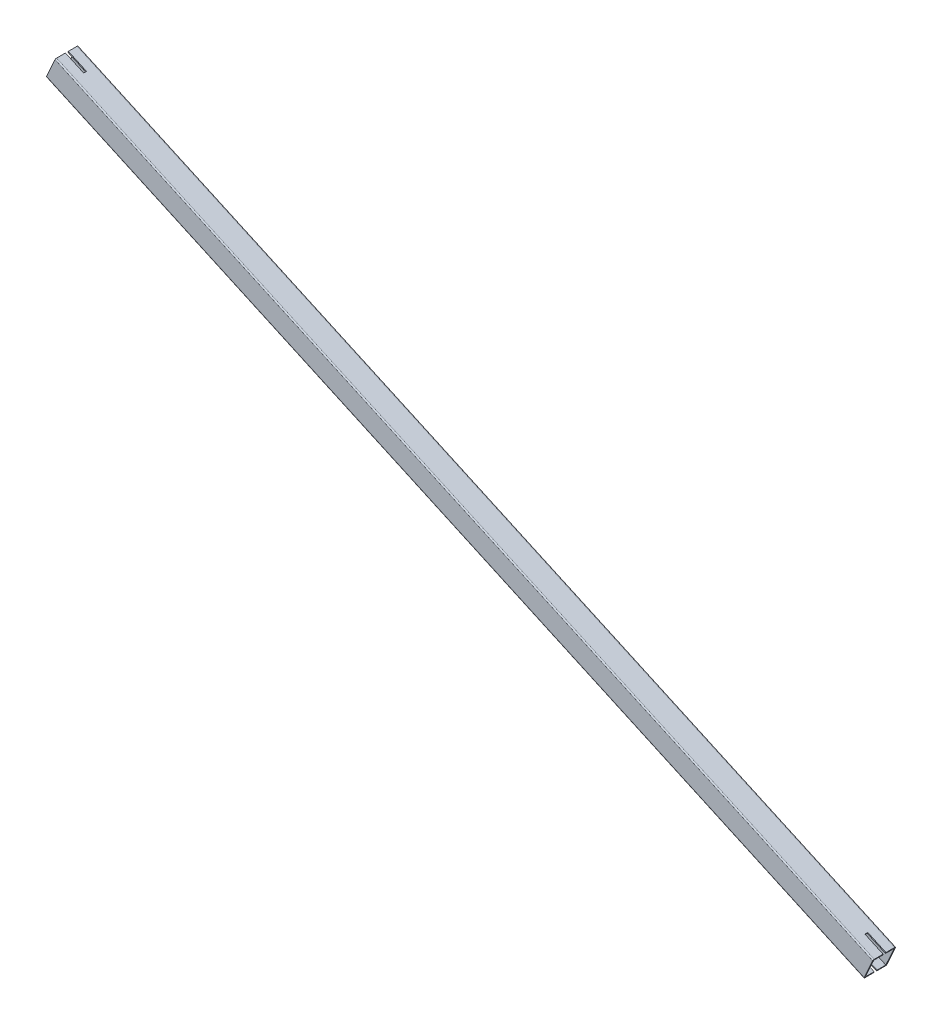
ISO-10303-21;
HEADER;
FILE_DESCRIPTION(('STEP AP214'),'2;1');
FILE_NAME('part.step','',(''),(''),'','','');
FILE_SCHEMA(('AUTOMOTIVE_DESIGN { 1 0 10303 214 1 1 1 1 }'));
ENDSEC;
DATA;
#1=APPLICATION_CONTEXT('core data for automotive mechanical design processes');
#2=APPLICATION_PROTOCOL_DEFINITION('international standard','automotive_design',2000,#1);
#3=PRODUCT_CONTEXT('',#1,'mechanical');
#4=PRODUCT('Part','Part','',(#3));
#5=PRODUCT_RELATED_PRODUCT_CATEGORY('part','',(#4));
#6=PRODUCT_DEFINITION_FORMATION('','',#4);
#7=PRODUCT_DEFINITION_CONTEXT('part definition',#1,'design');
#8=PRODUCT_DEFINITION('design','',#6,#7);
#9=PRODUCT_DEFINITION_SHAPE('','',#8);
#10=(LENGTH_UNIT() NAMED_UNIT(*) SI_UNIT(.MILLI.,.METRE.));
#11=(NAMED_UNIT(*) PLANE_ANGLE_UNIT() SI_UNIT($,.RADIAN.));
#12=(NAMED_UNIT(*) SI_UNIT($,.STERADIAN.) SOLID_ANGLE_UNIT());
#13=UNCERTAINTY_MEASURE_WITH_UNIT(LENGTH_MEASURE(1.E-05),#10,'distance_accuracy_value','');
#14=(GEOMETRIC_REPRESENTATION_CONTEXT(3) GLOBAL_UNCERTAINTY_ASSIGNED_CONTEXT((#13)) GLOBAL_UNIT_ASSIGNED_CONTEXT((#10,
#11,#12)) REPRESENTATION_CONTEXT('',''));
#15=CARTESIAN_POINT('',(0.,0.,0.));
#16=DIRECTION('',(0.,0.,1.));
#17=DIRECTION('',(1.,0.,0.));
#18=AXIS2_PLACEMENT_3D('',#15,#16,#17);
#19=CARTESIAN_POINT('',(2882.5508961991,-1270.70699172655,35.999));
#20=DIRECTION('',(0.910366477462605,-0.413802944301184,0.));
#21=DIRECTION('',(0.413802944301184,0.910366477462605,0.));
#22=AXIS2_PLACEMENT_3D('',#19,#20,#21);
#23=PLANE('',#22);
#24=DIRECTION('',(0.413802944301184,0.910366477462605,0.));
#25=VECTOR('',#24,1.);
#26=CARTESIAN_POINT('',(2882.5508961991,-1270.70699172655,-4.99999999999999));
#27=LINE('',#26,#25);
#28=CARTESIAN_POINT('',(2851.10228623516,-1339.89393364724,-4.99999999999999));
#29=VERTEX_POINT('',#28);
#30=CARTESIAN_POINT('',(2852.75749801236,-1336.25246773738,-4.99999999999999));
#31=VERTEX_POINT('',#30);
#32=EDGE_CURVE('E367',#29,#31,#27,.T.);
#33=ORIENTED_EDGE('',*,*,#32,.F.);
#34=DIRECTION('',(0.,0.,-1.));
#35=VECTOR('',#34,1.);
#36=CARTESIAN_POINT('',(2851.10228623516,-1339.89393364723,-35.999));
#37=LINE('',#36,#35);
#38=CARTESIAN_POINT('',(2851.10228623516,-1339.89393364723,-35.999));
#39=VERTEX_POINT('',#38);
#40=EDGE_CURVE('E410',#29,#39,#37,.T.);
#41=ORIENTED_EDGE('',*,*,#40,.T.);
#42=CARTESIAN_POINT('',(2852.75791181531,-1336.25155737091,-35.999));
#43=DIRECTION('',(0.910366477462605,-0.413802944301184,0.));
#44=DIRECTION('',(0.413802944301184,0.910366477462605,0.));
#45=AXIS2_PLACEMENT_3D('',#42,#43,#44);
#46=CIRCLE('',#45,4.00099999999998);
#47=CARTESIAN_POINT('',(2852.75791181531,-1336.25155737091,-40.));
#48=VERTEX_POINT('',#47);
#49=EDGE_CURVE('E414',#39,#48,#46,.T.);
#50=ORIENTED_EDGE('',*,*,#49,.T.);
#51=DIRECTION('',(0.413802944301188,0.910366477462603,0.));
#52=VECTOR('',#51,1.);
#53=CARTESIAN_POINT('',(2852.75791181531,-1336.25155737091,-40.));
#54=LINE('',#53,#52);
#55=CARTESIAN_POINT('',(2882.5508961991,-1270.70699172655,-40.));
#56=VERTEX_POINT('',#55);
#57=EDGE_CURVE('E416',#48,#56,#54,.T.);
#58=ORIENTED_EDGE('',*,*,#57,.T.);
#59=CARTESIAN_POINT('',(2882.5508961991,-1270.70699172655,-35.999));
#60=DIRECTION('',(0.910366477462605,-0.413802944301184,0.));
#61=DIRECTION('',(0.413802944301184,0.910366477462605,0.));
#62=AXIS2_PLACEMENT_3D('',#59,#60,#61);
#63=CIRCLE('',#62,4.00099999999998);
#64=CARTESIAN_POINT('',(2884.20652177925,-1267.06461545023,-35.999));
#65=VERTEX_POINT('',#64);
#66=EDGE_CURVE('E418',#56,#65,#63,.T.);
#67=ORIENTED_EDGE('',*,*,#66,.T.);
#68=DIRECTION('',(0.,0.,1.));
#69=VECTOR('',#68,1.);
#70=CARTESIAN_POINT('',(2884.20652177925,-1267.06461545023,35.999));
#71=LINE('',#70,#69);
#72=CARTESIAN_POINT('',(2884.20652177925,-1267.06461545023,-4.99999999999999));
#73=VERTEX_POINT('',#72);
#74=EDGE_CURVE('E344',#65,#73,#71,.T.);
#75=ORIENTED_EDGE('',*,*,#74,.T.);
#76=CARTESIAN_POINT('',(2882.55131000205,-1270.70608136008,-4.99999999999999));
#77=VERTEX_POINT('',#76);
#78=EDGE_CURVE('E366',#77,#73,#27,.T.);
#79=ORIENTED_EDGE('',*,*,#78,.F.);
#80=DIRECTION('',(0.,0.,1.));
#81=VECTOR('',#80,1.);
#82=CARTESIAN_POINT('',(2882.55131000205,-1270.70608136008,35.999));
#83=LINE('',#82,#81);
#84=CARTESIAN_POINT('',(2882.55131000205,-1270.70608136008,-35.999));
#85=VERTEX_POINT('',#84);
#86=EDGE_CURVE('E519',#85,#77,#83,.T.);
#87=ORIENTED_EDGE('',*,*,#86,.F.);
#88=CARTESIAN_POINT('',(2882.5508961991,-1270.70699172655,-35.999));
#89=DIRECTION('',(0.910366477462605,-0.413802944301184,0.));
#90=DIRECTION('',(0.413802944301184,0.910366477462605,0.));
#91=AXIS2_PLACEMENT_3D('',#88,#89,#90);
#92=CIRCLE('',#91,0.00100000000009845);
#93=CARTESIAN_POINT('',(2882.5508961991,-1270.70699172655,-36.0000000000001));
#94=VERTEX_POINT('',#93);
#95=EDGE_CURVE('E522',#94,#85,#92,.T.);
#96=ORIENTED_EDGE('',*,*,#95,.F.);
#97=DIRECTION('',(0.413802944301188,0.910366477462603,0.));
#98=VECTOR('',#97,1.);
#99=CARTESIAN_POINT('',(2852.75791181531,-1336.25155737091,-36.));
#100=LINE('',#99,#98);
#101=CARTESIAN_POINT('',(2852.75791181531,-1336.25155737091,-36.));
#102=VERTEX_POINT('',#101);
#103=EDGE_CURVE('E400',#102,#94,#100,.T.);
#104=ORIENTED_EDGE('',*,*,#103,.F.);
#105=CARTESIAN_POINT('',(2852.75791181531,-1336.25155737091,-35.999));
#106=DIRECTION('',(0.910366477462605,-0.413802944301184,0.));
#107=DIRECTION('',(0.413802944301184,0.910366477462605,0.));
#108=AXIS2_PLACEMENT_3D('',#105,#106,#107);
#109=CIRCLE('',#108,0.00100000000009845);
#110=CARTESIAN_POINT('',(2852.75749801236,-1336.25246773738,-35.999));
#111=VERTEX_POINT('',#110);
#112=EDGE_CURVE('E395',#111,#102,#109,.T.);
#113=ORIENTED_EDGE('',*,*,#112,.F.);
#114=DIRECTION('',(0.,0.,-1.));
#115=VECTOR('',#114,1.);
#116=CARTESIAN_POINT('',(2852.75749801236,-1336.25246773738,-35.999));
#117=LINE('',#116,#115);
#118=EDGE_CURVE('E386',#31,#111,#117,.T.);
#119=ORIENTED_EDGE('',*,*,#118,.F.);
#120=EDGE_LOOP('',(#33,#41,#50,#58,#67,#75,#79,#87,#96,#104,#113,#119));
#121=FACE_BOUND('',#120,.T.);
#122=ADVANCED_FACE('F60',(#121),#23,.T.);
#123=CARTESIAN_POINT('',(14.8964921918981,32.7722828221759,35.999));
#124=DIRECTION('',(0.910366477462605,-0.413802944301184,0.));
#125=DIRECTION('',(0.413802944301184,0.910366477462605,0.));
#126=AXIS2_PLACEMENT_3D('',#123,#124,#125);
#127=PLANE('',#126);
#128=DIRECTION('',(0.,0.,1.));
#129=VECTOR('',#128,1.);
#130=CARTESIAN_POINT('',(16.5521177720476,36.4146590985035,35.999));
#131=LINE('',#130,#129);
#132=CARTESIAN_POINT('',(16.5521177720472,36.4146590985039,5.));
#133=VERTEX_POINT('',#132);
#134=CARTESIAN_POINT('',(16.5521177720476,36.4146590985035,35.999));
#135=VERTEX_POINT('',#134);
#136=EDGE_CURVE('E312',#133,#135,#131,.T.);
#137=ORIENTED_EDGE('',*,*,#136,.F.);
#138=DIRECTION('',(-0.413802944301184,-0.910366477462605,0.));
#139=VECTOR('',#138,1.);
#140=CARTESIAN_POINT('',(14.8964921918981,32.7722828221759,5.));
#141=LINE('',#140,#139);
#142=CARTESIAN_POINT('',(14.8969059948423,32.773193188653,5.));
#143=VERTEX_POINT('',#142);
#144=EDGE_CURVE('E362',#133,#143,#141,.T.);
#145=ORIENTED_EDGE('',*,*,#144,.T.);
#146=DIRECTION('',(0.,0.,1.));
#147=VECTOR('',#146,1.);
#148=CARTESIAN_POINT('',(14.8969059948425,32.7731931886532,35.999));
#149=LINE('',#148,#147);
#150=CARTESIAN_POINT('',(14.8969059948429,32.7731931886523,35.999));
#151=VERTEX_POINT('',#150);
#152=EDGE_CURVE('E433',#143,#151,#149,.T.);
#153=ORIENTED_EDGE('',*,*,#152,.T.);
#154=CARTESIAN_POINT('',(14.8964921918981,32.7722828221759,35.999));
#155=DIRECTION('',(0.910366477462605,-0.413802944301184,0.));
#156=DIRECTION('',(0.413802944301184,0.910366477462605,0.));
#157=AXIS2_PLACEMENT_3D('',#154,#155,#156);
#158=CIRCLE('',#157,0.00100000000009151);
#159=CARTESIAN_POINT('',(14.8964921918981,32.7722828221759,36.));
#160=VERTEX_POINT('',#159);
#161=EDGE_CURVE('E430',#151,#160,#158,.T.);
#162=ORIENTED_EDGE('',*,*,#161,.T.);
#163=DIRECTION('',(-0.413802944301188,-0.910366477462603,0.));
#164=VECTOR('',#163,1.);
#165=CARTESIAN_POINT('',(14.8964921918981,32.7722828221759,36.));
#166=LINE('',#165,#164);
#167=CARTESIAN_POINT('',(-14.8964921918986,-32.7722828221768,36.));
#168=VERTEX_POINT('',#167);
#169=EDGE_CURVE('E426',#160,#168,#166,.T.);
#170=ORIENTED_EDGE('',*,*,#169,.T.);
#171=CARTESIAN_POINT('',(-14.8964921918986,-32.7722828221768,35.999));
#172=DIRECTION('',(0.910366477462605,-0.413802944301184,0.));
#173=DIRECTION('',(0.413802944301184,0.910366477462605,0.));
#174=AXIS2_PLACEMENT_3D('',#171,#172,#173);
#175=CIRCLE('',#174,0.00100000000009151);
#176=CARTESIAN_POINT('',(-14.8969059948425,-32.7731931886541,35.999));
#177=VERTEX_POINT('',#176);
#178=EDGE_CURVE('E423',#168,#177,#175,.T.);
#179=ORIENTED_EDGE('',*,*,#178,.T.);
#180=DIRECTION('',(0.,0.,-1.));
#181=VECTOR('',#180,1.);
#182=CARTESIAN_POINT('',(-14.8969059948425,-32.7731931886541,-35.999));
#183=LINE('',#182,#181);
#184=CARTESIAN_POINT('',(-14.8969059948426,-32.7731931886537,5.));
#185=VERTEX_POINT('',#184);
#186=EDGE_CURVE('E447',#177,#185,#183,.T.);
#187=ORIENTED_EDGE('',*,*,#186,.T.);
#188=CARTESIAN_POINT('',(-16.5521177720477,-36.4146590985051,5.));
#189=VERTEX_POINT('',#188);
#190=EDGE_CURVE('E282',#185,#189,#141,.T.);
#191=ORIENTED_EDGE('',*,*,#190,.T.);
#192=DIRECTION('',(0.,0.,-1.));
#193=VECTOR('',#192,1.);
#194=CARTESIAN_POINT('',(-16.5521177720476,-36.4146590985053,-35.999));
#195=LINE('',#194,#193);
#196=CARTESIAN_POINT('',(-16.5521177720476,-36.4146590985053,35.999));
#197=VERTEX_POINT('',#196);
#198=EDGE_CURVE('E300',#197,#189,#195,.T.);
#199=ORIENTED_EDGE('',*,*,#198,.F.);
#200=CARTESIAN_POINT('',(-14.8964921918986,-32.7722828221768,35.999));
#201=DIRECTION('',(0.910366477462605,-0.413802944301184,0.));
#202=DIRECTION('',(0.413802944301184,0.910366477462605,0.));
#203=AXIS2_PLACEMENT_3D('',#200,#201,#202);
#204=CIRCLE('',#203,4.00099999999998);
#205=CARTESIAN_POINT('',(-14.8964921918986,-32.7722828221768,40.));
#206=VERTEX_POINT('',#205);
#207=EDGE_CURVE('E301',#206,#197,#204,.T.);
#208=ORIENTED_EDGE('',*,*,#207,.F.);
#209=DIRECTION('',(-0.413802944301188,-0.910366477462603,0.));
#210=VECTOR('',#209,1.);
#211=CARTESIAN_POINT('',(14.8964921918981,32.7722828221759,40.));
#212=LINE('',#211,#210);
#213=CARTESIAN_POINT('',(14.8964921918981,32.7722828221759,40.));
#214=VERTEX_POINT('',#213);
#215=EDGE_CURVE('E303',#214,#206,#212,.T.);
#216=ORIENTED_EDGE('',*,*,#215,.F.);
#217=CARTESIAN_POINT('',(14.8964921918981,32.7722828221759,35.999));
#218=DIRECTION('',(0.910366477462605,-0.413802944301184,0.));
#219=DIRECTION('',(0.413802944301184,0.910366477462605,0.));
#220=AXIS2_PLACEMENT_3D('',#217,#218,#219);
#221=CIRCLE('',#220,4.00099999999998);
#222=EDGE_CURVE('E450',#135,#214,#221,.T.);
#223=ORIENTED_EDGE('',*,*,#222,.F.);
#224=EDGE_LOOP('',(#137,#145,#153,#162,#170,#179,#187,#191,#199,#208,#216,#223));
#225=FACE_BOUND('',#224,.T.);
#226=ADVANCED_FACE('F465',(#225),#127,.F.);
#227=CARTESIAN_POINT('',(2882.5508961991,-1270.70699172655,35.999));
#228=DIRECTION('',(-0.910366477462605,0.413802944301184,0.));
#229=DIRECTION('',(-0.413802944301184,-0.910366477462605,0.));
#230=AXIS2_PLACEMENT_3D('',#227,#228,#229);
#231=CYLINDRICAL_SURFACE('',#230,4.00099999999998);
#232=ORIENTED_EDGE('',*,*,#222,.T.);
#233=DIRECTION('',(-0.910366477462605,0.413802944301184,0.));
#234=VECTOR('',#233,1.);
#235=CARTESIAN_POINT('',(2882.5508961991,-1270.70699172655,40.));
#236=LINE('',#235,#234);
#237=CARTESIAN_POINT('',(2882.5508961991,-1270.70699172655,40.));
#238=VERTEX_POINT('',#237);
#239=EDGE_CURVE('E338',#238,#214,#236,.T.);
#240=ORIENTED_EDGE('',*,*,#239,.F.);
#241=CARTESIAN_POINT('',(2882.5508961991,-1270.70699172655,35.999));
#242=DIRECTION('',(0.910366477462605,-0.413802944301184,0.));
#243=DIRECTION('',(0.413802944301184,0.910366477462605,0.));
#244=AXIS2_PLACEMENT_3D('',#241,#242,#243);
#245=CIRCLE('',#244,4.00099999999998);
#246=CARTESIAN_POINT('',(2884.20652177925,-1267.06461545023,35.999));
#247=VERTEX_POINT('',#246);
#248=EDGE_CURVE('E399',#247,#238,#245,.T.);
#249=ORIENTED_EDGE('',*,*,#248,.F.);
#250=DIRECTION('',(-0.910366477462605,0.413802944301184,0.));
#251=VECTOR('',#250,1.);
#252=CARTESIAN_POINT('',(2884.20652177925,-1267.06461545023,35.999));
#253=LINE('',#252,#251);
#254=EDGE_CURVE('E317',#247,#135,#253,.T.);
#255=ORIENTED_EDGE('',*,*,#254,.T.);
#256=EDGE_LOOP('',(#232,#240,#249,#255));
#257=FACE_BOUND('',#256,.T.);
#258=ADVANCED_FACE('F479',(#257),#231,.T.);
#259=CARTESIAN_POINT('',(2882.5508961991,-1270.70699172655,40.));
#260=DIRECTION('',(0.,0.,-1.));
#261=DIRECTION('',(-1.,0.,0.));
#262=AXIS2_PLACEMENT_3D('',#259,#260,#261);
#263=PLANE('',#262);
#264=ORIENTED_EDGE('',*,*,#215,.T.);
#265=DIRECTION('',(-0.910366477462605,0.413802944301184,0.));
#266=VECTOR('',#265,1.);
#267=CARTESIAN_POINT('',(2852.75791181531,-1336.25155737091,40.));
#268=LINE('',#267,#266);
#269=CARTESIAN_POINT('',(2852.75791181531,-1336.25155737091,40.));
#270=VERTEX_POINT('',#269);
#271=EDGE_CURVE('E335',#270,#206,#268,.T.);
#272=ORIENTED_EDGE('',*,*,#271,.F.);
#273=DIRECTION('',(-0.413802944301188,-0.910366477462603,0.));
#274=VECTOR('',#273,1.);
#275=CARTESIAN_POINT('',(2882.5508961991,-1270.70699172655,40.));
#276=LINE('',#275,#274);
#277=EDGE_CURVE('E406',#238,#270,#276,.T.);
#278=ORIENTED_EDGE('',*,*,#277,.F.);
#279=ORIENTED_EDGE('',*,*,#239,.T.);
#280=EDGE_LOOP('',(#264,#272,#278,#279));
#281=FACE_BOUND('',#280,.T.);
#282=ADVANCED_FACE('F454',(#281),#263,.F.);
#283=CARTESIAN_POINT('',(2852.75791181531,-1336.25155737091,35.999));
#284=DIRECTION('',(-0.910366477462605,0.413802944301184,0.));
#285=DIRECTION('',(-0.413802944301184,-0.910366477462605,0.));
#286=AXIS2_PLACEMENT_3D('',#283,#284,#285);
#287=CYLINDRICAL_SURFACE('',#286,4.00099999999998);
#288=ORIENTED_EDGE('',*,*,#207,.T.);
#289=DIRECTION('',(-0.910366477462605,0.413802944301184,0.));
#290=VECTOR('',#289,1.);
#291=CARTESIAN_POINT('',(2851.10228623516,-1339.89393364723,35.999));
#292=LINE('',#291,#290);
#293=CARTESIAN_POINT('',(2851.10228623516,-1339.89393364723,35.999));
#294=VERTEX_POINT('',#293);
#295=EDGE_CURVE('E332',#294,#197,#292,.T.);
#296=ORIENTED_EDGE('',*,*,#295,.F.);
#297=CARTESIAN_POINT('',(2852.75791181531,-1336.25155737091,35.999));
#298=DIRECTION('',(0.910366477462605,-0.413802944301184,0.));
#299=DIRECTION('',(0.413802944301184,0.910366477462605,0.));
#300=AXIS2_PLACEMENT_3D('',#297,#298,#299);
#301=CIRCLE('',#300,4.00099999999998);
#302=EDGE_CURVE('E408',#270,#294,#301,.T.);
#303=ORIENTED_EDGE('',*,*,#302,.F.);
#304=ORIENTED_EDGE('',*,*,#271,.T.);
#305=EDGE_LOOP('',(#288,#296,#303,#304));
#306=FACE_BOUND('',#305,.T.);
#307=ADVANCED_FACE('F461',(#306),#287,.T.);
#308=CARTESIAN_POINT('',(2851.10228623516,-1339.89393364723,-35.999));
#309=DIRECTION('',(0.413802944301184,0.910366477462605,0.));
#310=DIRECTION('',(-0.910366477462605,0.413802944301184,0.));
#311=AXIS2_PLACEMENT_3D('',#308,#309,#310);
#312=PLANE('',#311);
#313=ORIENTED_EDGE('',*,*,#198,.T.);
#314=DIRECTION('',(-0.910366477462605,0.413802944301184,0.));
#315=VECTOR('',#314,1.);
#316=CARTESIAN_POINT('',(-16.5521177720477,-36.4146590985051,5.));
#317=LINE('',#316,#315);
#318=CARTESIAN_POINT('',(47.1735356503347,-65.3808651995879,5.));
#319=VERTEX_POINT('',#318);
#320=EDGE_CURVE('E466',#319,#189,#317,.T.);
#321=ORIENTED_EDGE('',*,*,#320,.F.);
#322=DIRECTION('',(0.,0.,1.));
#323=VECTOR('',#322,1.);
#324=CARTESIAN_POINT('',(47.1735356503347,-65.3808651995879,5.));
#325=LINE('',#324,#323);
#326=CARTESIAN_POINT('',(47.1735356503347,-65.3808651995879,-5.));
#327=VERTEX_POINT('',#326);
#328=EDGE_CURVE('E293',#327,#319,#325,.T.);
#329=ORIENTED_EDGE('',*,*,#328,.F.);
#330=DIRECTION('',(0.910366477462605,-0.413802944301184,0.));
#331=VECTOR('',#330,1.);
#332=CARTESIAN_POINT('',(-16.5521177720477,-36.4146590985051,-5.));
#333=LINE('',#332,#331);
#334=CARTESIAN_POINT('',(-16.5521177720477,-36.4146590985051,-5.));
#335=VERTEX_POINT('',#334);
#336=EDGE_CURVE('E275',#335,#327,#333,.T.);
#337=ORIENTED_EDGE('',*,*,#336,.F.);
#338=CARTESIAN_POINT('',(-16.5521177720476,-36.4146590985053,-35.999));
#339=VERTEX_POINT('',#338);
#340=EDGE_CURVE('E289',#335,#339,#195,.T.);
#341=ORIENTED_EDGE('',*,*,#340,.T.);
#342=DIRECTION('',(-0.910366477462605,0.413802944301184,0.));
#343=VECTOR('',#342,1.);
#344=CARTESIAN_POINT('',(2851.10228623516,-1339.89393364723,-35.999));
#345=LINE('',#344,#343);
#346=EDGE_CURVE('E330',#39,#339,#345,.T.);
#347=ORIENTED_EDGE('',*,*,#346,.F.);
#348=ORIENTED_EDGE('',*,*,#40,.F.);
#349=DIRECTION('',(0.910366477462604,-0.413802944301185,0.));
#350=VECTOR('',#349,1.);
#351=CARTESIAN_POINT('',(2851.10228623516,-1339.89393364724,-4.99999999999999));
#352=LINE('',#351,#350);
#353=CARTESIAN_POINT('',(2787.37663281278,-1310.92772754615,-5.));
#354=VERTEX_POINT('',#353);
#355=EDGE_CURVE('E378',#354,#29,#352,.T.);
#356=ORIENTED_EDGE('',*,*,#355,.F.);
#357=DIRECTION('',(0.,0.,-1.));
#358=VECTOR('',#357,1.);
#359=CARTESIAN_POINT('',(2787.37663281278,-1310.92772754615,5.));
#360=LINE('',#359,#358);
#361=CARTESIAN_POINT('',(2787.37663281278,-1310.92772754615,5.));
#362=VERTEX_POINT('',#361);
#363=EDGE_CURVE('E558',#362,#354,#360,.T.);
#364=ORIENTED_EDGE('',*,*,#363,.F.);
#365=DIRECTION('',(-0.910366477462604,0.413802944301185,0.));
#366=VECTOR('',#365,1.);
#367=CARTESIAN_POINT('',(2851.10228623516,-1339.89393364724,4.99999999999999));
#368=LINE('',#367,#366);
#369=CARTESIAN_POINT('',(2851.10228623516,-1339.89393364724,4.99999999999999));
#370=VERTEX_POINT('',#369);
#371=EDGE_CURVE('E471',#370,#362,#368,.T.);
#372=ORIENTED_EDGE('',*,*,#371,.F.);
#373=EDGE_CURVE('E411',#294,#370,#37,.T.);
#374=ORIENTED_EDGE('',*,*,#373,.F.);
#375=ORIENTED_EDGE('',*,*,#295,.T.);
#376=EDGE_LOOP('',(#313,#321,#329,#337,#341,#347,#348,#356,#364,#372,#374,#375));
#377=FACE_BOUND('',#376,.T.);
#378=ADVANCED_FACE('F287',(#377),#312,.F.);
#379=CARTESIAN_POINT('',(2852.75791181531,-1336.25155737091,-35.999));
#380=DIRECTION('',(-0.910366477462605,0.413802944301184,0.));
#381=DIRECTION('',(-0.413802944301184,-0.910366477462605,0.));
#382=AXIS2_PLACEMENT_3D('',#379,#380,#381);
#383=CYLINDRICAL_SURFACE('',#382,4.00099999999998);
#384=CARTESIAN_POINT('',(-14.8964921918986,-32.7722828221768,-35.999));
#385=DIRECTION('',(0.910366477462605,-0.413802944301184,0.));
#386=DIRECTION('',(0.413802944301184,0.910366477462605,0.));
#387=AXIS2_PLACEMENT_3D('',#384,#385,#386);
#388=CIRCLE('',#387,4.00099999999998);
#389=CARTESIAN_POINT('',(-14.8964921918986,-32.7722828221768,-40.));
#390=VERTEX_POINT('',#389);
#391=EDGE_CURVE('E299',#339,#390,#388,.T.);
#392=ORIENTED_EDGE('',*,*,#391,.T.);
#393=DIRECTION('',(-0.910366477462605,0.413802944301184,0.));
#394=VECTOR('',#393,1.);
#395=CARTESIAN_POINT('',(2852.75791181531,-1336.25155737091,-40.));
#396=LINE('',#395,#394);
#397=EDGE_CURVE('E327',#48,#390,#396,.T.);
#398=ORIENTED_EDGE('',*,*,#397,.F.);
#399=ORIENTED_EDGE('',*,*,#49,.F.);
#400=ORIENTED_EDGE('',*,*,#346,.T.);
#401=EDGE_LOOP('',(#392,#398,#399,#400));
#402=FACE_BOUND('',#401,.T.);
#403=ADVANCED_FACE('F621',(#402),#383,.T.);
#404=CARTESIAN_POINT('',(2852.75791181531,-1336.25155737091,-40.));
#405=DIRECTION('',(0.,0.,1.));
#406=DIRECTION('',(1.,0.,0.));
#407=AXIS2_PLACEMENT_3D('',#404,#405,#406);
#408=PLANE('',#407);
#409=DIRECTION('',(0.413802944301188,0.910366477462603,0.));
#410=VECTOR('',#409,1.);
#411=CARTESIAN_POINT('',(-14.8964921918986,-32.7722828221768,-40.));
#412=LINE('',#411,#410);
#413=CARTESIAN_POINT('',(14.8964921918981,32.7722828221759,-40.));
#414=VERTEX_POINT('',#413);
#415=EDGE_CURVE('E308',#390,#414,#412,.T.);
#416=ORIENTED_EDGE('',*,*,#415,.T.);
#417=DIRECTION('',(-0.910366477462605,0.413802944301184,0.));
#418=VECTOR('',#417,1.);
#419=CARTESIAN_POINT('',(2882.5508961991,-1270.70699172655,-40.));
#420=LINE('',#419,#418);
#421=EDGE_CURVE('E324',#56,#414,#420,.T.);
#422=ORIENTED_EDGE('',*,*,#421,.F.);
#423=ORIENTED_EDGE('',*,*,#57,.F.);
#424=ORIENTED_EDGE('',*,*,#397,.T.);
#425=EDGE_LOOP('',(#416,#422,#423,#424));
#426=FACE_BOUND('',#425,.T.);
#427=ADVANCED_FACE('F617',(#426),#408,.F.);
#428=CARTESIAN_POINT('',(2882.5508961991,-1270.70699172655,-35.999));
#429=DIRECTION('',(-0.910366477462605,0.413802944301184,0.));
#430=DIRECTION('',(-0.413802944301184,-0.910366477462605,0.));
#431=AXIS2_PLACEMENT_3D('',#428,#429,#430);
#432=CYLINDRICAL_SURFACE('',#431,4.00099999999998);
#433=CARTESIAN_POINT('',(14.8964921918981,32.7722828221759,-35.999));
#434=DIRECTION('',(0.910366477462605,-0.413802944301184,0.));
#435=DIRECTION('',(0.413802944301184,0.910366477462605,0.));
#436=AXIS2_PLACEMENT_3D('',#433,#434,#435);
#437=CIRCLE('',#436,4.00099999999998);
#438=CARTESIAN_POINT('',(16.5521177720476,36.4146590985035,-35.999));
#439=VERTEX_POINT('',#438);
#440=EDGE_CURVE('E310',#414,#439,#437,.T.);
#441=ORIENTED_EDGE('',*,*,#440,.T.);
#442=DIRECTION('',(-0.910366477462605,0.413802944301184,0.));
#443=VECTOR('',#442,1.);
#444=CARTESIAN_POINT('',(2884.20652177925,-1267.06461545023,-35.999));
#445=LINE('',#444,#443);
#446=EDGE_CURVE('E320',#65,#439,#445,.T.);
#447=ORIENTED_EDGE('',*,*,#446,.F.);
#448=ORIENTED_EDGE('',*,*,#66,.F.);
#449=ORIENTED_EDGE('',*,*,#421,.T.);
#450=EDGE_LOOP('',(#441,#447,#448,#449));
#451=FACE_BOUND('',#450,.T.);
#452=ADVANCED_FACE('F614',(#451),#432,.T.);
#453=CARTESIAN_POINT('',(2852.75791181531,-1336.25155737091,35.999));
#454=DIRECTION('',(-0.910366477462605,0.413802944301184,0.));
#455=DIRECTION('',(-0.413802944301184,-0.910366477462605,0.));
#456=AXIS2_PLACEMENT_3D('',#453,#454,#455);
#457=CYLINDRICAL_SURFACE('',#456,0.00100000000009151);
#458=ORIENTED_EDGE('',*,*,#178,.F.);
#459=DIRECTION('',(-0.910366477462605,0.413802944301184,0.));
#460=VECTOR('',#459,1.);
#461=CARTESIAN_POINT('',(2852.75791181531,-1336.25155737091,36.));
#462=LINE('',#461,#460);
#463=CARTESIAN_POINT('',(2852.75791181531,-1336.25155737091,36.));
#464=VERTEX_POINT('',#463);
#465=EDGE_CURVE('E321',#464,#168,#462,.T.);
#466=ORIENTED_EDGE('',*,*,#465,.F.);
#467=CARTESIAN_POINT('',(2852.75791181531,-1336.25155737091,35.999));
#468=DIRECTION('',(0.910366477462605,-0.413802944301184,0.));
#469=DIRECTION('',(0.413802944301184,0.910366477462605,0.));
#470=AXIS2_PLACEMENT_3D('',#467,#468,#469);
#471=CIRCLE('',#470,0.00100000000009151);
#472=CARTESIAN_POINT('',(2852.75749801236,-1336.25246773738,35.999));
#473=VERTEX_POINT('',#472);
#474=EDGE_CURVE('E316',#464,#473,#471,.T.);
#475=ORIENTED_EDGE('',*,*,#474,.T.);
#476=DIRECTION('',(-0.910366477462605,0.413802944301184,0.));
#477=VECTOR('',#476,1.);
#478=CARTESIAN_POINT('',(2852.75749801236,-1336.25246773738,35.999));
#479=LINE('',#478,#477);
#480=EDGE_CURVE('E341',#473,#177,#479,.T.);
#481=ORIENTED_EDGE('',*,*,#480,.T.);
#482=EDGE_LOOP('',(#458,#466,#475,#481));
#483=FACE_BOUND('',#482,.T.);
#484=ADVANCED_FACE('F62',(#483),#457,.F.);
#485=CARTESIAN_POINT('',(2882.5508961991,-1270.70699172655,36.));
#486=DIRECTION('',(0.,0.,-1.));
#487=DIRECTION('',(-1.,0.,0.));
#488=AXIS2_PLACEMENT_3D('',#485,#486,#487);
#489=PLANE('',#488);
#490=ORIENTED_EDGE('',*,*,#169,.F.);
#491=DIRECTION('',(-0.910366477462605,0.413802944301184,0.));
#492=VECTOR('',#491,1.);
#493=CARTESIAN_POINT('',(2882.5508961991,-1270.70699172655,36.));
#494=LINE('',#493,#492);
#495=CARTESIAN_POINT('',(2882.5508961991,-1270.70699172655,36.));
#496=VERTEX_POINT('',#495);
#497=EDGE_CURVE('E356',#496,#160,#494,.T.);
#498=ORIENTED_EDGE('',*,*,#497,.F.);
#499=DIRECTION('',(-0.413802944301188,-0.910366477462603,0.));
#500=VECTOR('',#499,1.);
#501=CARTESIAN_POINT('',(2882.5508961991,-1270.70699172655,36.));
#502=LINE('',#501,#500);
#503=EDGE_CURVE('E512',#496,#464,#502,.T.);
#504=ORIENTED_EDGE('',*,*,#503,.T.);
#505=ORIENTED_EDGE('',*,*,#465,.T.);
#506=EDGE_LOOP('',(#490,#498,#504,#505));
#507=FACE_BOUND('',#506,.T.);
#508=ADVANCED_FACE('F577',(#507),#489,.T.);
#509=CARTESIAN_POINT('',(2882.5508961991,-1270.70699172655,35.999));
#510=DIRECTION('',(-0.910366477462605,0.413802944301184,0.));
#511=DIRECTION('',(-0.413802944301184,-0.910366477462605,0.));
#512=AXIS2_PLACEMENT_3D('',#509,#510,#511);
#513=CYLINDRICAL_SURFACE('',#512,0.00100000000009151);
#514=ORIENTED_EDGE('',*,*,#161,.F.);
#515=DIRECTION('',(-0.910366477462605,0.413802944301184,0.));
#516=VECTOR('',#515,1.);
#517=CARTESIAN_POINT('',(2882.55131000205,-1270.70608136008,35.999));
#518=LINE('',#517,#516);
#519=CARTESIAN_POINT('',(2882.55131000205,-1270.70608136008,35.999));
#520=VERTEX_POINT('',#519);
#521=EDGE_CURVE('E353',#520,#151,#518,.T.);
#522=ORIENTED_EDGE('',*,*,#521,.F.);
#523=CARTESIAN_POINT('',(2882.5508961991,-1270.70699172655,35.999));
#524=DIRECTION('',(0.910366477462605,-0.413802944301184,0.));
#525=DIRECTION('',(0.413802944301184,0.910366477462605,0.));
#526=AXIS2_PLACEMENT_3D('',#523,#524,#525);
#527=CIRCLE('',#526,0.00100000000009151);
#528=EDGE_CURVE('E515',#520,#496,#527,.T.);
#529=ORIENTED_EDGE('',*,*,#528,.T.);
#530=ORIENTED_EDGE('',*,*,#497,.T.);
#531=EDGE_LOOP('',(#514,#522,#529,#530));
#532=FACE_BOUND('',#531,.T.);
#533=ADVANCED_FACE('F573',(#532),#513,.F.);
#534=CARTESIAN_POINT('',(2882.55131000205,-1270.70608136008,35.999));
#535=DIRECTION('',(-0.413802944301184,-0.910366477462605,0.));
#536=DIRECTION('',(0.910366477462605,-0.413802944301184,0.));
#537=AXIS2_PLACEMENT_3D('',#534,#535,#536);
#538=PLANE('',#537);
#539=DIRECTION('',(-0.910366477462605,0.413802944301184,0.));
#540=VECTOR('',#539,1.);
#541=CARTESIAN_POINT('',(2882.55131000205,-1270.70608136008,5.));
#542=LINE('',#541,#540);
#543=CARTESIAN_POINT('',(78.6225594172248,3.80698708757055,5.));
#544=VERTEX_POINT('',#543);
#545=EDGE_CURVE('E492',#544,#143,#542,.T.);
#546=ORIENTED_EDGE('',*,*,#545,.F.);
#547=DIRECTION('',(0.,0.,1.));
#548=VECTOR('',#547,1.);
#549=CARTESIAN_POINT('',(78.6225594172247,3.80698708757055,35.999));
#550=LINE('',#549,#548);
#551=CARTESIAN_POINT('',(78.6225594172245,3.80698708757121,-5.));
#552=VERTEX_POINT('',#551);
#553=EDGE_CURVE('E427',#552,#544,#550,.T.);
#554=ORIENTED_EDGE('',*,*,#553,.F.);
#555=DIRECTION('',(0.910366477462605,-0.413802944301184,0.));
#556=VECTOR('',#555,1.);
#557=CARTESIAN_POINT('',(2882.55131000205,-1270.70608136008,-5.));
#558=LINE('',#557,#556);
#559=CARTESIAN_POINT('',(14.8969059948423,32.773193188653,-5.));
#560=VERTEX_POINT('',#559);
#561=EDGE_CURVE('E490',#560,#552,#558,.T.);
#562=ORIENTED_EDGE('',*,*,#561,.F.);
#563=CARTESIAN_POINT('',(14.8969059948425,32.7731931886532,-35.999));
#564=VERTEX_POINT('',#563);
#565=EDGE_CURVE('E434',#564,#560,#149,.T.);
#566=ORIENTED_EDGE('',*,*,#565,.F.);
#567=DIRECTION('',(-0.910366477462605,0.413802944301184,0.));
#568=VECTOR('',#567,1.);
#569=CARTESIAN_POINT('',(2882.55131000205,-1270.70608136008,-35.999));
#570=LINE('',#569,#568);
#571=EDGE_CURVE('E351',#85,#564,#570,.T.);
#572=ORIENTED_EDGE('',*,*,#571,.F.);
#573=ORIENTED_EDGE('',*,*,#86,.T.);
#574=DIRECTION('',(0.910366477462605,-0.413802944301184,0.));
#575=VECTOR('',#574,1.);
#576=CARTESIAN_POINT('',(2882.55131000205,-1270.70608136008,-4.99999999999999));
#577=LINE('',#576,#575);
#578=CARTESIAN_POINT('',(2818.82565657967,-1241.73987525899,-5.));
#579=VERTEX_POINT('',#578);
#580=EDGE_CURVE('E389',#579,#77,#577,.T.);
#581=ORIENTED_EDGE('',*,*,#580,.F.);
#582=DIRECTION('',(0.,0.,-1.));
#583=VECTOR('',#582,1.);
#584=CARTESIAN_POINT('',(2818.82565657967,-1241.73987525899,35.999));
#585=LINE('',#584,#583);
#586=CARTESIAN_POINT('',(2818.82565657967,-1241.73987525899,5.));
#587=VERTEX_POINT('',#586);
#588=EDGE_CURVE('E505',#587,#579,#585,.T.);
#589=ORIENTED_EDGE('',*,*,#588,.F.);
#590=DIRECTION('',(-0.910366477462605,0.413802944301184,0.));
#591=VECTOR('',#590,1.);
#592=CARTESIAN_POINT('',(2882.55131000205,-1270.70608136008,4.99999999999999));
#593=LINE('',#592,#591);
#594=CARTESIAN_POINT('',(2882.55131000205,-1270.70608136008,4.99999999999999));
#595=VERTEX_POINT('',#594);
#596=EDGE_CURVE('E500',#595,#587,#593,.T.);
#597=ORIENTED_EDGE('',*,*,#596,.F.);
#598=EDGE_CURVE('E518',#595,#520,#83,.T.);
#599=ORIENTED_EDGE('',*,*,#598,.T.);
#600=ORIENTED_EDGE('',*,*,#521,.T.);
#601=ORIENTED_EDGE('',*,*,#152,.F.);
#602=EDGE_LOOP('',(#546,#554,#562,#566,#572,#573,#581,#589,#597,#599,#600,#601));
#603=FACE_BOUND('',#602,.T.);
#604=ADVANCED_FACE('F541',(#603),#538,.T.);
#605=CARTESIAN_POINT('',(2882.5508961991,-1270.70699172655,-35.999));
#606=DIRECTION('',(-0.910366477462605,0.413802944301184,0.));
#607=DIRECTION('',(-0.413802944301184,-0.910366477462605,0.));
#608=AXIS2_PLACEMENT_3D('',#605,#606,#607);
#609=CYLINDRICAL_SURFACE('',#608,0.00100000000009845);
#610=CARTESIAN_POINT('',(14.8964921918981,32.7722828221759,-35.999));
#611=DIRECTION('',(0.910366477462605,-0.413802944301184,0.));
#612=DIRECTION('',(0.413802944301184,0.910366477462605,0.));
#613=AXIS2_PLACEMENT_3D('',#610,#611,#612);
#614=CIRCLE('',#613,0.00100000000009845);
#615=CARTESIAN_POINT('',(14.8964921918981,32.7722828221759,-36.0000000000001));
#616=VERTEX_POINT('',#615);
#617=EDGE_CURVE('E437',#616,#564,#614,.T.);
#618=ORIENTED_EDGE('',*,*,#617,.F.);
#619=DIRECTION('',(-0.910366477462605,0.413802944301184,0.));
#620=VECTOR('',#619,1.);
#621=CARTESIAN_POINT('',(2882.5508961991,-1270.70699172655,-36.0000000000001));
#622=LINE('',#621,#620);
#623=EDGE_CURVE('E349',#94,#616,#622,.T.);
#624=ORIENTED_EDGE('',*,*,#623,.F.);
#625=ORIENTED_EDGE('',*,*,#95,.T.);
#626=ORIENTED_EDGE('',*,*,#571,.T.);
#627=EDGE_LOOP('',(#618,#624,#625,#626));
#628=FACE_BOUND('',#627,.T.);
#629=ADVANCED_FACE('F537',(#628),#609,.F.);
#630=CARTESIAN_POINT('',(2852.75791181531,-1336.25155737091,-36.));
#631=DIRECTION('',(0.,0.,1.));
#632=DIRECTION('',(1.,0.,0.));
#633=AXIS2_PLACEMENT_3D('',#630,#631,#632);
#634=PLANE('',#633);
#635=DIRECTION('',(0.413802944301188,0.910366477462603,0.));
#636=VECTOR('',#635,1.);
#637=CARTESIAN_POINT('',(-14.8964921918986,-32.7722828221768,-36.));
#638=LINE('',#637,#636);
#639=CARTESIAN_POINT('',(-14.8964921918986,-32.7722828221768,-36.));
#640=VERTEX_POINT('',#639);
#641=EDGE_CURVE('E440',#640,#616,#638,.T.);
#642=ORIENTED_EDGE('',*,*,#641,.F.);
#643=DIRECTION('',(-0.910366477462605,0.413802944301184,0.));
#644=VECTOR('',#643,1.);
#645=CARTESIAN_POINT('',(2852.75791181531,-1336.25155737091,-36.));
#646=LINE('',#645,#644);
#647=EDGE_CURVE('E347',#102,#640,#646,.T.);
#648=ORIENTED_EDGE('',*,*,#647,.F.);
#649=ORIENTED_EDGE('',*,*,#103,.T.);
#650=ORIENTED_EDGE('',*,*,#623,.T.);
#651=EDGE_LOOP('',(#642,#648,#649,#650));
#652=FACE_BOUND('',#651,.T.);
#653=ADVANCED_FACE('F527',(#652),#634,.T.);
#654=CARTESIAN_POINT('',(2852.75791181531,-1336.25155737091,-35.999));
#655=DIRECTION('',(-0.910366477462605,0.413802944301184,0.));
#656=DIRECTION('',(-0.413802944301184,-0.910366477462605,0.));
#657=AXIS2_PLACEMENT_3D('',#654,#655,#656);
#658=CYLINDRICAL_SURFACE('',#657,0.00100000000009845);
#659=CARTESIAN_POINT('',(-14.8964921918986,-32.7722828221768,-35.999));
#660=DIRECTION('',(0.910366477462605,-0.413802944301184,0.));
#661=DIRECTION('',(0.413802944301184,0.910366477462605,0.));
#662=AXIS2_PLACEMENT_3D('',#659,#660,#661);
#663=CIRCLE('',#662,0.00100000000009845);
#664=CARTESIAN_POINT('',(-14.8969059948434,-32.7731931886532,-35.999));
#665=VERTEX_POINT('',#664);
#666=EDGE_CURVE('E443',#665,#640,#663,.T.);
#667=ORIENTED_EDGE('',*,*,#666,.F.);
#668=DIRECTION('',(-0.910366477462605,0.413802944301184,0.));
#669=VECTOR('',#668,1.);
#670=CARTESIAN_POINT('',(2852.75749801236,-1336.25246773738,-35.999));
#671=LINE('',#670,#669);
#672=EDGE_CURVE('E343',#111,#665,#671,.T.);
#673=ORIENTED_EDGE('',*,*,#672,.F.);
#674=ORIENTED_EDGE('',*,*,#112,.T.);
#675=ORIENTED_EDGE('',*,*,#647,.T.);
#676=EDGE_LOOP('',(#667,#673,#674,#675));
#677=FACE_BOUND('',#676,.T.);
#678=ADVANCED_FACE('F533',(#677),#658,.F.);
#679=CARTESIAN_POINT('',(2852.75749801236,-1336.25246773738,-35.999));
#680=DIRECTION('',(0.413802944301184,0.910366477462605,0.));
#681=DIRECTION('',(-0.910366477462605,0.413802944301184,0.));
#682=AXIS2_PLACEMENT_3D('',#679,#680,#681);
#683=PLANE('',#682);
#684=DIRECTION('',(0.910366477462605,-0.413802944301184,0.));
#685=VECTOR('',#684,1.);
#686=CARTESIAN_POINT('',(2852.75749801236,-1336.25246773738,5.));
#687=LINE('',#686,#685);
#688=CARTESIAN_POINT('',(48.8287474275397,-61.7393992897366,5.));
#689=VERTEX_POINT('',#688);
#690=EDGE_CURVE('E489',#185,#689,#687,.T.);
#691=ORIENTED_EDGE('',*,*,#690,.F.);
#692=ORIENTED_EDGE('',*,*,#186,.F.);
#693=ORIENTED_EDGE('',*,*,#480,.F.);
#694=CARTESIAN_POINT('',(2852.75749801236,-1336.25246773738,4.99999999999999));
#695=VERTEX_POINT('',#694);
#696=EDGE_CURVE('E396',#473,#695,#117,.T.);
#697=ORIENTED_EDGE('',*,*,#696,.T.);
#698=DIRECTION('',(0.910366477462605,-0.413802944301184,0.));
#699=VECTOR('',#698,1.);
#700=CARTESIAN_POINT('',(2852.75749801236,-1336.25246773738,4.99999999999999));
#701=LINE('',#700,#699);
#702=CARTESIAN_POINT('',(2789.03184458998,-1307.2862616363,5.));
#703=VERTEX_POINT('',#702);
#704=EDGE_CURVE('E83',#703,#695,#701,.T.);
#705=ORIENTED_EDGE('',*,*,#704,.F.);
#706=DIRECTION('',(0.,0.,1.));
#707=VECTOR('',#706,1.);
#708=CARTESIAN_POINT('',(2789.03184458998,-1307.2862616363,-35.999));
#709=LINE('',#708,#707);
#710=CARTESIAN_POINT('',(2789.03184458998,-1307.2862616363,-5.));
#711=VERTEX_POINT('',#710);
#712=EDGE_CURVE('E388',#711,#703,#709,.T.);
#713=ORIENTED_EDGE('',*,*,#712,.F.);
#714=DIRECTION('',(-0.910366477462605,0.413802944301184,0.));
#715=VECTOR('',#714,1.);
#716=CARTESIAN_POINT('',(2852.75749801236,-1336.25246773738,-4.99999999999999));
#717=LINE('',#716,#715);
#718=EDGE_CURVE('E375',#31,#711,#717,.T.);
#719=ORIENTED_EDGE('',*,*,#718,.F.);
#720=ORIENTED_EDGE('',*,*,#118,.T.);
#721=ORIENTED_EDGE('',*,*,#672,.T.);
#722=CARTESIAN_POINT('',(-14.8969059948425,-32.7731931886541,-5.));
#723=VERTEX_POINT('',#722);
#724=EDGE_CURVE('E446',#723,#665,#183,.T.);
#725=ORIENTED_EDGE('',*,*,#724,.F.);
#726=DIRECTION('',(-0.910366477462605,0.413802944301184,0.));
#727=VECTOR('',#726,1.);
#728=CARTESIAN_POINT('',(2852.75749801236,-1336.25246773738,-5.));
#729=LINE('',#728,#727);
#730=CARTESIAN_POINT('',(48.8287474275395,-61.7393992897362,-5.));
#731=VERTEX_POINT('',#730);
#732=EDGE_CURVE('E278',#731,#723,#729,.T.);
#733=ORIENTED_EDGE('',*,*,#732,.F.);
#734=DIRECTION('',(0.,0.,-1.));
#735=VECTOR('',#734,1.);
#736=CARTESIAN_POINT('',(48.8287474275397,-61.7393992897368,-35.999));
#737=LINE('',#736,#735);
#738=EDGE_CURVE('E507',#689,#731,#737,.T.);
#739=ORIENTED_EDGE('',*,*,#738,.F.);
#740=EDGE_LOOP('',(#691,#692,#693,#697,#705,#713,#719,#720,#721,#725,#733,#739));
#741=FACE_BOUND('',#740,.T.);
#742=ADVANCED_FACE('F385',(#741),#683,.T.);
#743=CARTESIAN_POINT('',(2884.20652177925,-1267.06461545023,35.999));
#744=DIRECTION('',(-0.413802944301184,-0.910366477462605,0.));
#745=DIRECTION('',(0.910366477462605,-0.413802944301184,0.));
#746=AXIS2_PLACEMENT_3D('',#743,#744,#745);
#747=PLANE('',#746);
#748=DIRECTION('',(0.,0.,1.));
#749=VECTOR('',#748,1.);
#750=CARTESIAN_POINT('',(80.2777711944298,7.44845299742081,35.999));
#751=LINE('',#750,#749);
#752=CARTESIAN_POINT('',(80.2777711944292,7.44845299742147,-5.));
#753=VERTEX_POINT('',#752);
#754=CARTESIAN_POINT('',(80.2777711944296,7.44845299742103,5.));
#755=VERTEX_POINT('',#754);
#756=EDGE_CURVE('E12',#753,#755,#751,.T.);
#757=ORIENTED_EDGE('',*,*,#756,.T.);
#758=DIRECTION('',(-0.910366477462605,0.413802944301184,0.));
#759=VECTOR('',#758,1.);
#760=CARTESIAN_POINT('',(2884.20652177925,-1267.06461545023,5.));
#761=LINE('',#760,#759);
#762=EDGE_CURVE('E484',#755,#133,#761,.T.);
#763=ORIENTED_EDGE('',*,*,#762,.T.);
#764=ORIENTED_EDGE('',*,*,#136,.T.);
#765=ORIENTED_EDGE('',*,*,#254,.F.);
#766=CARTESIAN_POINT('',(2884.20652177925,-1267.06461545023,4.99999999999999));
#767=VERTEX_POINT('',#766);
#768=EDGE_CURVE('E420',#767,#247,#71,.T.);
#769=ORIENTED_EDGE('',*,*,#768,.F.);
#770=DIRECTION('',(-0.910366477462605,0.413802944301184,0.));
#771=VECTOR('',#770,1.);
#772=CARTESIAN_POINT('',(2884.20652177925,-1267.06461545023,4.99999999999999));
#773=LINE('',#772,#771);
#774=CARTESIAN_POINT('',(2820.48086835687,-1238.09840934914,5.));
#775=VERTEX_POINT('',#774);
#776=EDGE_CURVE('E75',#767,#775,#773,.T.);
#777=ORIENTED_EDGE('',*,*,#776,.T.);
#778=DIRECTION('',(0.,0.,-1.));
#779=VECTOR('',#778,1.);
#780=CARTESIAN_POINT('',(2820.48086835687,-1238.09840934914,35.999));
#781=LINE('',#780,#779);
#782=CARTESIAN_POINT('',(2820.48086835687,-1238.09840934914,-5.));
#783=VERTEX_POINT('',#782);
#784=EDGE_CURVE('E68',#775,#783,#781,.T.);
#785=ORIENTED_EDGE('',*,*,#784,.T.);
#786=DIRECTION('',(0.910366477462605,-0.413802944301184,0.));
#787=VECTOR('',#786,1.);
#788=CARTESIAN_POINT('',(2884.20652177925,-1267.06461545023,-4.99999999999999));
#789=LINE('',#788,#787);
#790=EDGE_CURVE('E390',#783,#73,#789,.T.);
#791=ORIENTED_EDGE('',*,*,#790,.T.);
#792=ORIENTED_EDGE('',*,*,#74,.F.);
#793=ORIENTED_EDGE('',*,*,#446,.T.);
#794=CARTESIAN_POINT('',(16.5521177720476,36.4146590985035,-5.));
#795=VERTEX_POINT('',#794);
#796=EDGE_CURVE('E313',#439,#795,#131,.T.);
#797=ORIENTED_EDGE('',*,*,#796,.T.);
#798=DIRECTION('',(0.910366477462605,-0.413802944301184,0.));
#799=VECTOR('',#798,1.);
#800=CARTESIAN_POINT('',(2884.20652177925,-1267.06461545023,-5.));
#801=LINE('',#800,#799);
#802=EDGE_CURVE('E567',#795,#753,#801,.T.);
#803=ORIENTED_EDGE('',*,*,#802,.T.);
#804=EDGE_LOOP('',(#757,#763,#764,#765,#769,#777,#785,#791,#792,#793,#797,#803));
#805=FACE_BOUND('',#804,.T.);
#806=ADVANCED_FACE('F483',(#805),#747,.F.);
#807=DIRECTION('',(-0.413802944301184,-0.910366477462605,0.));
#808=VECTOR('',#807,1.);
#809=CARTESIAN_POINT('',(2882.5508961991,-1270.70699172655,4.99999999999999));
#810=LINE('',#809,#808);
#811=EDGE_CURVE('E365',#767,#595,#810,.T.);
#812=ORIENTED_EDGE('',*,*,#811,.F.);
#813=ORIENTED_EDGE('',*,*,#768,.T.);
#814=ORIENTED_EDGE('',*,*,#248,.T.);
#815=ORIENTED_EDGE('',*,*,#277,.T.);
#816=ORIENTED_EDGE('',*,*,#302,.T.);
#817=ORIENTED_EDGE('',*,*,#373,.T.);
#818=EDGE_CURVE('E363',#695,#370,#810,.T.);
#819=ORIENTED_EDGE('',*,*,#818,.F.);
#820=ORIENTED_EDGE('',*,*,#696,.F.);
#821=ORIENTED_EDGE('',*,*,#474,.F.);
#822=ORIENTED_EDGE('',*,*,#503,.F.);
#823=ORIENTED_EDGE('',*,*,#528,.F.);
#824=ORIENTED_EDGE('',*,*,#598,.F.);
#825=EDGE_LOOP('',(#812,#813,#814,#815,#816,#817,#819,#820,#821,#822,#823,#824));
#826=FACE_BOUND('',#825,.T.);
#827=ADVANCED_FACE('F473',(#826),#23,.T.);
#828=ORIENTED_EDGE('',*,*,#340,.F.);
#829=DIRECTION('',(0.413802944301184,0.910366477462605,0.));
#830=VECTOR('',#829,1.);
#831=CARTESIAN_POINT('',(14.8964921918981,32.7722828221759,-5.));
#832=LINE('',#831,#830);
#833=EDGE_CURVE('E271',#335,#723,#832,.T.);
#834=ORIENTED_EDGE('',*,*,#833,.T.);
#835=ORIENTED_EDGE('',*,*,#724,.T.);
#836=ORIENTED_EDGE('',*,*,#666,.T.);
#837=ORIENTED_EDGE('',*,*,#641,.T.);
#838=ORIENTED_EDGE('',*,*,#617,.T.);
#839=ORIENTED_EDGE('',*,*,#565,.T.);
#840=EDGE_CURVE('E283',#560,#795,#832,.T.);
#841=ORIENTED_EDGE('',*,*,#840,.T.);
#842=ORIENTED_EDGE('',*,*,#796,.F.);
#843=ORIENTED_EDGE('',*,*,#440,.F.);
#844=ORIENTED_EDGE('',*,*,#415,.F.);
#845=ORIENTED_EDGE('',*,*,#391,.F.);
#846=EDGE_LOOP('',(#828,#834,#835,#836,#837,#838,#839,#841,#842,#843,#844,#845));
#847=FACE_BOUND('',#846,.T.);
#848=ADVANCED_FACE('F297',(#847),#127,.F.);
#849=CARTESIAN_POINT('',(507.58883078698,1116.69542773136,5.));
#850=DIRECTION('',(0.,0.,1.));
#851=DIRECTION('',(1.,0.,0.));
#852=AXIS2_PLACEMENT_3D('',#849,#850,#851);
#853=PLANE('',#852);
#854=ORIENTED_EDGE('',*,*,#545,.T.);
#855=ORIENTED_EDGE('',*,*,#144,.F.);
#856=ORIENTED_EDGE('',*,*,#762,.F.);
#857=DIRECTION('',(-0.413802944301184,-0.910366477462605,0.));
#858=VECTOR('',#857,1.);
#859=CARTESIAN_POINT('',(571.314484209362,1087.72922163027,5.));
#860=LINE('',#859,#858);
#861=EDGE_CURVE('E553',#755,#544,#860,.T.);
#862=ORIENTED_EDGE('',*,*,#861,.T.);
#863=EDGE_LOOP('',(#854,#855,#856,#862));
#864=FACE_BOUND('',#863,.T.);
#865=ADVANCED_FACE('F568',(#864),#853,.F.);
#866=CARTESIAN_POINT('',(507.58883078698,1116.69542773136,-5.));
#867=DIRECTION('',(0.,0.,-1.));
#868=DIRECTION('',(-1.,0.,0.));
#869=AXIS2_PLACEMENT_3D('',#866,#867,#868);
#870=PLANE('',#869);
#871=ORIENTED_EDGE('',*,*,#561,.T.);
#872=DIRECTION('',(-0.413802944301184,-0.910366477462605,0.));
#873=VECTOR('',#872,1.);
#874=CARTESIAN_POINT('',(571.314484209362,1087.72922163027,-5.));
#875=LINE('',#874,#873);
#876=EDGE_CURVE('E547',#753,#552,#875,.T.);
#877=ORIENTED_EDGE('',*,*,#876,.F.);
#878=ORIENTED_EDGE('',*,*,#802,.F.);
#879=ORIENTED_EDGE('',*,*,#840,.F.);
#880=EDGE_LOOP('',(#871,#877,#878,#879));
#881=FACE_BOUND('',#880,.T.);
#882=ADVANCED_FACE('F546',(#881),#870,.F.);
#883=CARTESIAN_POINT('',(571.314484209362,1087.72922163027,5.));
#884=DIRECTION('',(0.910366477462605,-0.413802944301184,0.));
#885=DIRECTION('',(0.413802944301184,0.910366477462605,0.));
#886=AXIS2_PLACEMENT_3D('',#883,#884,#885);
#887=PLANE('',#886);
#888=ORIENTED_EDGE('',*,*,#553,.T.);
#889=ORIENTED_EDGE('',*,*,#861,.F.);
#890=ORIENTED_EDGE('',*,*,#756,.F.);
#891=ORIENTED_EDGE('',*,*,#876,.T.);
#892=EDGE_LOOP('',(#888,#889,#890,#891));
#893=FACE_BOUND('',#892,.T.);
#894=ADVANCED_FACE('F549',(#893),#887,.F.);
#895=ORIENTED_EDGE('',*,*,#738,.T.);
#896=EDGE_CURVE('E551',#731,#327,#875,.T.);
#897=ORIENTED_EDGE('',*,*,#896,.T.);
#898=ORIENTED_EDGE('',*,*,#328,.T.);
#899=EDGE_CURVE('E550',#689,#319,#860,.T.);
#900=ORIENTED_EDGE('',*,*,#899,.F.);
#901=EDGE_LOOP('',(#895,#897,#898,#900));
#902=FACE_BOUND('',#901,.T.);
#903=ADVANCED_FACE('F586',(#902),#887,.F.);
#904=ORIENTED_EDGE('',*,*,#690,.T.);
#905=ORIENTED_EDGE('',*,*,#899,.T.);
#906=ORIENTED_EDGE('',*,*,#320,.T.);
#907=ORIENTED_EDGE('',*,*,#190,.F.);
#908=EDGE_LOOP('',(#904,#905,#906,#907));
#909=FACE_BOUND('',#908,.T.);
#910=ADVANCED_FACE('F584',(#909),#853,.F.);
#911=ORIENTED_EDGE('',*,*,#732,.T.);
#912=ORIENTED_EDGE('',*,*,#833,.F.);
#913=ORIENTED_EDGE('',*,*,#336,.T.);
#914=ORIENTED_EDGE('',*,*,#896,.F.);
#915=EDGE_LOOP('',(#911,#912,#913,#914));
#916=FACE_BOUND('',#915,.T.);
#917=ADVANCED_FACE('F273',(#916),#870,.F.);
#918=CARTESIAN_POINT('',(3375.24323479419,-186.783846817375,4.99999999999999));
#919=DIRECTION('',(0.,0.,1.));
#920=DIRECTION('',(1.,0.,0.));
#921=AXIS2_PLACEMENT_3D('',#918,#919,#920);
#922=PLANE('',#921);
#923=ORIENTED_EDGE('',*,*,#704,.T.);
#924=ORIENTED_EDGE('',*,*,#818,.T.);
#925=ORIENTED_EDGE('',*,*,#371,.T.);
#926=DIRECTION('',(-0.413802944301184,-0.910366477462605,0.));
#927=VECTOR('',#926,1.);
#928=CARTESIAN_POINT('',(3311.5175813718,-157.817640716292,5.));
#929=LINE('',#928,#927);
#930=EDGE_CURVE('E562',#703,#362,#929,.T.);
#931=ORIENTED_EDGE('',*,*,#930,.F.);
#932=EDGE_LOOP('',(#923,#924,#925,#931));
#933=FACE_BOUND('',#932,.T.);
#934=ADVANCED_FACE('F827',(#933),#922,.F.);
#935=CARTESIAN_POINT('',(3375.24323479419,-186.783846817375,-4.99999999999999));
#936=DIRECTION('',(0.,0.,-1.));
#937=DIRECTION('',(-1.,0.,0.));
#938=AXIS2_PLACEMENT_3D('',#935,#936,#937);
#939=PLANE('',#938);
#940=ORIENTED_EDGE('',*,*,#718,.T.);
#941=DIRECTION('',(-0.413802944301184,-0.910366477462605,0.));
#942=VECTOR('',#941,1.);
#943=CARTESIAN_POINT('',(3311.5175813718,-157.817640716292,-5.));
#944=LINE('',#943,#942);
#945=EDGE_CURVE('E563',#711,#354,#944,.T.);
#946=ORIENTED_EDGE('',*,*,#945,.T.);
#947=ORIENTED_EDGE('',*,*,#355,.T.);
#948=ORIENTED_EDGE('',*,*,#32,.T.);
#949=EDGE_LOOP('',(#940,#946,#947,#948));
#950=FACE_BOUND('',#949,.T.);
#951=ADVANCED_FACE('F374',(#950),#939,.F.);
#952=CARTESIAN_POINT('',(3311.5175813718,-157.817640716292,5.));
#953=DIRECTION('',(-0.910366477462605,0.413802944301184,0.));
#954=DIRECTION('',(-0.413802944301184,-0.910366477462605,0.));
#955=AXIS2_PLACEMENT_3D('',#952,#953,#954);
#956=PLANE('',#955);
#957=ORIENTED_EDGE('',*,*,#712,.T.);
#958=ORIENTED_EDGE('',*,*,#930,.T.);
#959=ORIENTED_EDGE('',*,*,#363,.T.);
#960=ORIENTED_EDGE('',*,*,#945,.F.);
#961=EDGE_LOOP('',(#957,#958,#959,#960));
#962=FACE_BOUND('',#961,.T.);
#963=ADVANCED_FACE('F843',(#962),#956,.F.);
#964=ORIENTED_EDGE('',*,*,#588,.T.);
#965=EDGE_CURVE('E294',#783,#579,#944,.T.);
#966=ORIENTED_EDGE('',*,*,#965,.F.);
#967=ORIENTED_EDGE('',*,*,#784,.F.);
#968=EDGE_CURVE('E565',#775,#587,#929,.T.);
#969=ORIENTED_EDGE('',*,*,#968,.T.);
#970=EDGE_LOOP('',(#964,#966,#967,#969));
#971=FACE_BOUND('',#970,.T.);
#972=ADVANCED_FACE('F853',(#971),#956,.F.);
#973=ORIENTED_EDGE('',*,*,#580,.T.);
#974=ORIENTED_EDGE('',*,*,#78,.T.);
#975=ORIENTED_EDGE('',*,*,#790,.F.);
#976=ORIENTED_EDGE('',*,*,#965,.T.);
#977=EDGE_LOOP('',(#973,#974,#975,#976));
#978=FACE_BOUND('',#977,.T.);
#979=ADVANCED_FACE('F845',(#978),#939,.F.);
#980=ORIENTED_EDGE('',*,*,#596,.T.);
#981=ORIENTED_EDGE('',*,*,#968,.F.);
#982=ORIENTED_EDGE('',*,*,#776,.F.);
#983=ORIENTED_EDGE('',*,*,#811,.T.);
#984=EDGE_LOOP('',(#980,#981,#982,#983));
#985=FACE_BOUND('',#984,.T.);
#986=ADVANCED_FACE('F835',(#985),#922,.F.);
#987=CLOSED_SHELL('',(#122,#226,#258,#282,#307,#378,#403,#427,#452,#484,#508,#533,#604,#629,
#653,#678,#742,#806,#827,#848,#865,#882,#894,#903,#910,#917,#934,#951,#963,#972,#979,#986));
#988=MANIFOLD_SOLID_BREP('B2',#987);
#989=ADVANCED_BREP_SHAPE_REPRESENTATION('',(#18,#988),#14);
#990=SHAPE_DEFINITION_REPRESENTATION(#9,#989);
ENDSEC;
END-ISO-10303-21;
